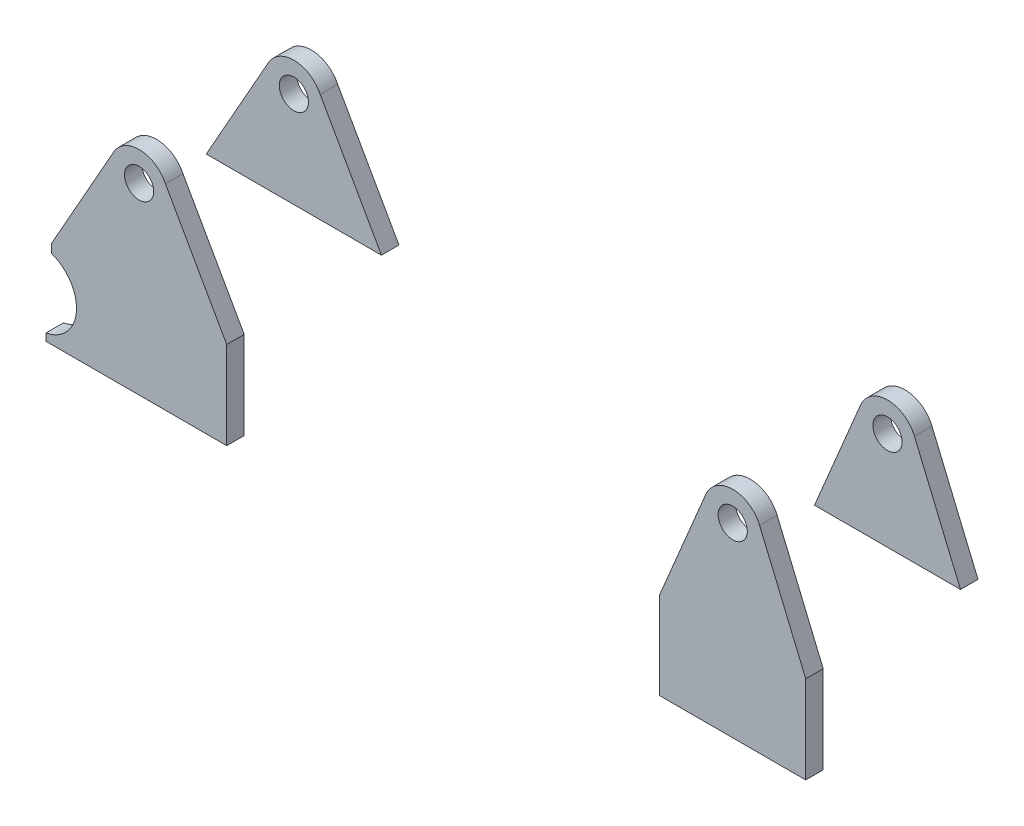
ISO-10303-21;
HEADER;
FILE_DESCRIPTION(('STEP AP214'),'2;1');
FILE_NAME('part.step','',(''),(''),'','','');
FILE_SCHEMA(('AUTOMOTIVE_DESIGN { 1 0 10303 214 1 1 1 1 }'));
ENDSEC;
DATA;
#1=APPLICATION_CONTEXT('core data for automotive mechanical design processes');
#2=APPLICATION_PROTOCOL_DEFINITION('international standard','automotive_design',2000,#1);
#3=PRODUCT_CONTEXT('',#1,'mechanical');
#4=PRODUCT('Part','Part','',(#3));
#5=PRODUCT_RELATED_PRODUCT_CATEGORY('part','',(#4));
#6=PRODUCT_DEFINITION_FORMATION('','',#4);
#7=PRODUCT_DEFINITION_CONTEXT('part definition',#1,'design');
#8=PRODUCT_DEFINITION('design','',#6,#7);
#9=PRODUCT_DEFINITION_SHAPE('','',#8);
#10=(LENGTH_UNIT() NAMED_UNIT(*) SI_UNIT(.MILLI.,.METRE.));
#11=(NAMED_UNIT(*) PLANE_ANGLE_UNIT() SI_UNIT($,.RADIAN.));
#12=(NAMED_UNIT(*) SI_UNIT($,.STERADIAN.) SOLID_ANGLE_UNIT());
#13=UNCERTAINTY_MEASURE_WITH_UNIT(LENGTH_MEASURE(1.E-05),#10,'distance_accuracy_value','');
#14=(GEOMETRIC_REPRESENTATION_CONTEXT(3) GLOBAL_UNCERTAINTY_ASSIGNED_CONTEXT((#13)) GLOBAL_UNIT_ASSIGNED_CONTEXT((#10,
#11,#12)) REPRESENTATION_CONTEXT('',''));
#15=CARTESIAN_POINT('',(0.,0.,0.));
#16=DIRECTION('',(0.,0.,1.));
#17=DIRECTION('',(1.,0.,0.));
#18=AXIS2_PLACEMENT_3D('',#15,#16,#17);
#19=CARTESIAN_POINT('',(-252.417857944728,105.942621529783,-53.));
#20=DIRECTION('',(0.922077125771915,-0.38700616807514,0.));
#21=DIRECTION('',(0.38700616807514,0.922077125771915,0.));
#22=AXIS2_PLACEMENT_3D('',#19,#20,#21);
#23=PLANE('',#22);
#24=DIRECTION('',(0.38700616807514,0.922077125771915,0.));
#25=VECTOR('',#24,1.);
#26=CARTESIAN_POINT('',(-252.417857944728,105.942621529783,-47.));
#27=LINE('',#26,#25);
#28=CARTESIAN_POINT('',(-529.12660318611,-553.340939135816,-47.));
#29=VERTEX_POINT('',#28);
#30=CARTESIAN_POINT('',(-513.347374443829,-515.745502458551,-47.));
#31=VERTEX_POINT('',#30);
#32=EDGE_CURVE('E121',#29,#31,#27,.T.);
#33=ORIENTED_EDGE('',*,*,#32,.T.);
#34=DIRECTION('',(0.,0.,1.));
#35=VECTOR('',#34,1.);
#36=CARTESIAN_POINT('',(-513.347374443829,-515.745502458551,-53.));
#37=LINE('',#36,#35);
#38=CARTESIAN_POINT('',(-513.347374443829,-515.745502458551,-53.));
#39=VERTEX_POINT('',#38);
#40=EDGE_CURVE('E12',#39,#31,#37,.T.);
#41=ORIENTED_EDGE('',*,*,#40,.F.);
#42=DIRECTION('',(0.38700616807514,0.922077125771915,0.));
#43=VECTOR('',#42,1.);
#44=CARTESIAN_POINT('',(-252.417857944728,105.942621529783,-53.));
#45=LINE('',#44,#43);
#46=CARTESIAN_POINT('',(-529.12660318611,-553.340939135816,-53.));
#47=VERTEX_POINT('',#46);
#48=EDGE_CURVE('E104',#47,#39,#45,.T.);
#49=ORIENTED_EDGE('',*,*,#48,.F.);
#50=DIRECTION('',(0.,0.,1.));
#51=VECTOR('',#50,1.);
#52=CARTESIAN_POINT('',(-529.12660318611,-553.340939135816,-53.));
#53=LINE('',#52,#51);
#54=EDGE_CURVE('E71',#47,#29,#53,.T.);
#55=ORIENTED_EDGE('',*,*,#54,.T.);
#56=EDGE_LOOP('',(#33,#41,#49,#55));
#57=FACE_BOUND('',#56,.T.);
#58=ADVANCED_FACE('F54',(#57),#23,.F.);
#59=CARTESIAN_POINT('',(-504.126603186094,-519.615564139322,-53.));
#60=DIRECTION('',(0.,0.,1.));
#61=DIRECTION('',(1.,0.,0.));
#62=AXIS2_PLACEMENT_3D('',#59,#60,#61);
#63=CYLINDRICAL_SURFACE('',#62,10.0000000000078);
#64=CARTESIAN_POINT('',(-504.126603186094,-519.615564139322,-47.));
#65=DIRECTION('',(0.,0.,-1.));
#66=DIRECTION('',(-1.,0.,0.));
#67=AXIS2_PLACEMENT_3D('',#64,#65,#66);
#68=CIRCLE('',#67,10.0000000000078);
#69=CARTESIAN_POINT('',(-494.905831928391,-515.745502458551,-47.));
#70=VERTEX_POINT('',#69);
#71=EDGE_CURVE('E109',#31,#70,#68,.T.);
#72=ORIENTED_EDGE('',*,*,#71,.T.);
#73=DIRECTION('',(0.,0.,1.));
#74=VECTOR('',#73,1.);
#75=CARTESIAN_POINT('',(-494.905831928391,-515.745502458551,-53.));
#76=LINE('',#75,#74);
#77=CARTESIAN_POINT('',(-494.905831928391,-515.745502458551,-53.));
#78=VERTEX_POINT('',#77);
#79=EDGE_CURVE('E63',#78,#70,#76,.T.);
#80=ORIENTED_EDGE('',*,*,#79,.F.);
#81=CARTESIAN_POINT('',(-504.126603186094,-519.615564139322,-53.));
#82=DIRECTION('',(0.,0.,-1.));
#83=DIRECTION('',(-1.,0.,0.));
#84=AXIS2_PLACEMENT_3D('',#81,#82,#83);
#85=CIRCLE('',#84,10.0000000000078);
#86=EDGE_CURVE('E97',#39,#78,#85,.T.);
#87=ORIENTED_EDGE('',*,*,#86,.F.);
#88=ORIENTED_EDGE('',*,*,#40,.T.);
#89=EDGE_LOOP('',(#72,#80,#87,#88));
#90=FACE_BOUND('',#89,.T.);
#91=ADVANCED_FACE('F108',(#90),#63,.T.);
#92=CARTESIAN_POINT('',(-604.825460432263,-253.85206644208,-53.));
#93=DIRECTION('',(-0.922077125771914,-0.387006168075142,0.));
#94=DIRECTION('',(0.387006168075142,-0.922077125771914,0.));
#95=AXIS2_PLACEMENT_3D('',#92,#93,#94);
#96=PLANE('',#95);
#97=DIRECTION('',(0.387006168075142,-0.922077125771914,0.));
#98=VECTOR('',#97,1.);
#99=CARTESIAN_POINT('',(-604.825460432263,-253.85206644208,-47.));
#100=LINE('',#99,#98);
#101=CARTESIAN_POINT('',(-479.12660318611,-553.340939135816,-47.));
#102=VERTEX_POINT('',#101);
#103=EDGE_CURVE('E124',#70,#102,#100,.T.);
#104=ORIENTED_EDGE('',*,*,#103,.T.);
#105=DIRECTION('',(0.,0.,1.));
#106=VECTOR('',#105,1.);
#107=CARTESIAN_POINT('',(-479.12660318611,-553.340939135816,-53.));
#108=LINE('',#107,#106);
#109=CARTESIAN_POINT('',(-479.12660318611,-553.340939135816,-53.));
#110=VERTEX_POINT('',#109);
#111=EDGE_CURVE('E86',#110,#102,#108,.T.);
#112=ORIENTED_EDGE('',*,*,#111,.F.);
#113=DIRECTION('',(0.387006168075142,-0.922077125771914,0.));
#114=VECTOR('',#113,1.);
#115=CARTESIAN_POINT('',(-604.825460432263,-253.85206644208,-53.));
#116=LINE('',#115,#114);
#117=EDGE_CURVE('E103',#78,#110,#116,.T.);
#118=ORIENTED_EDGE('',*,*,#117,.F.);
#119=ORIENTED_EDGE('',*,*,#79,.T.);
#120=EDGE_LOOP('',(#104,#112,#118,#119));
#121=FACE_BOUND('',#120,.T.);
#122=ADVANCED_FACE('F112',(#121),#96,.F.);
#123=CARTESIAN_POINT('',(-504.126603186094,-519.615564139322,-53.));
#124=DIRECTION('',(0.,0.,1.));
#125=DIRECTION('',(1.,0.,0.));
#126=AXIS2_PLACEMENT_3D('',#123,#124,#125);
#127=CYLINDRICAL_SURFACE('',#126,5.00000000003834);
#128=CARTESIAN_POINT('',(-504.126603186094,-519.615564139322,-53.));
#129=DIRECTION('',(0.,0.,-1.));
#130=DIRECTION('',(-1.,0.,0.));
#131=AXIS2_PLACEMENT_3D('',#128,#129,#130);
#132=CIRCLE('',#131,5.00000000003834);
#133=CARTESIAN_POINT('',(-509.126603186132,-519.615564139322,-53.));
#134=VERTEX_POINT('',#133);
#135=EDGE_CURVE('E129',#134,#134,#132,.T.);
#136=ORIENTED_EDGE('',*,*,#135,.T.);
#137=EDGE_LOOP('',(#136));
#138=FACE_BOUND('',#137,.T.);
#139=CARTESIAN_POINT('',(-504.126603186094,-519.615564139322,-47.));
#140=DIRECTION('',(0.,0.,-1.));
#141=DIRECTION('',(-1.,0.,0.));
#142=AXIS2_PLACEMENT_3D('',#139,#140,#141);
#143=CIRCLE('',#142,5.00000000003834);
#144=CARTESIAN_POINT('',(-509.126603186132,-519.615564139322,-47.));
#145=VERTEX_POINT('',#144);
#146=EDGE_CURVE('E118',#145,#145,#143,.T.);
#147=ORIENTED_EDGE('',*,*,#146,.F.);
#148=EDGE_LOOP('',(#147));
#149=FACE_BOUND('',#148,.T.);
#150=ADVANCED_FACE('F56',(#138,#149),#127,.F.);
#151=CARTESIAN_POINT('',(0.,-553.340939135816,-53.));
#152=DIRECTION('',(0.,-1.,0.));
#153=DIRECTION('',(0.,0.,-1.));
#154=AXIS2_PLACEMENT_3D('',#151,#152,#153);
#155=PLANE('',#154);
#156=DIRECTION('',(1.,0.,0.));
#157=VECTOR('',#156,1.);
#158=CARTESIAN_POINT('',(0.,-553.340939135816,-47.));
#159=LINE('',#158,#157);
#160=EDGE_CURVE('E126',#29,#102,#159,.T.);
#161=ORIENTED_EDGE('',*,*,#160,.F.);
#162=ORIENTED_EDGE('',*,*,#54,.F.);
#163=DIRECTION('',(1.,0.,0.));
#164=VECTOR('',#163,1.);
#165=CARTESIAN_POINT('',(0.,-553.340939135816,-53.));
#166=LINE('',#165,#164);
#167=EDGE_CURVE('E113',#47,#110,#166,.T.);
#168=ORIENTED_EDGE('',*,*,#167,.T.);
#169=ORIENTED_EDGE('',*,*,#111,.T.);
#170=EDGE_LOOP('',(#161,#162,#168,#169));
#171=FACE_BOUND('',#170,.T.);
#172=ADVANCED_FACE('F140',(#171),#155,.T.);
#173=CARTESIAN_POINT('',(0.,0.,-53.));
#174=DIRECTION('',(0.,0.,-1.));
#175=DIRECTION('',(-1.,0.,0.));
#176=AXIS2_PLACEMENT_3D('',#173,#174,#175);
#177=PLANE('',#176);
#178=ORIENTED_EDGE('',*,*,#135,.F.);
#179=EDGE_LOOP('',(#178));
#180=FACE_BOUND('',#179,.T.);
#181=ORIENTED_EDGE('',*,*,#48,.T.);
#182=ORIENTED_EDGE('',*,*,#86,.T.);
#183=ORIENTED_EDGE('',*,*,#117,.T.);
#184=ORIENTED_EDGE('',*,*,#167,.F.);
#185=EDGE_LOOP('',(#181,#182,#183,#184));
#186=FACE_BOUND('',#185,.T.);
#187=ADVANCED_FACE('F100',(#180,#186),#177,.T.);
#188=CARTESIAN_POINT('',(0.,0.,-47.));
#189=DIRECTION('',(0.,0.,-1.));
#190=DIRECTION('',(-1.,0.,0.));
#191=AXIS2_PLACEMENT_3D('',#188,#189,#190);
#192=PLANE('',#191);
#193=ORIENTED_EDGE('',*,*,#146,.T.);
#194=EDGE_LOOP('',(#193));
#195=FACE_BOUND('',#194,.T.);
#196=ORIENTED_EDGE('',*,*,#32,.F.);
#197=ORIENTED_EDGE('',*,*,#160,.T.);
#198=ORIENTED_EDGE('',*,*,#103,.F.);
#199=ORIENTED_EDGE('',*,*,#71,.F.);
#200=EDGE_LOOP('',(#196,#197,#198,#199));
#201=FACE_BOUND('',#200,.T.);
#202=ADVANCED_FACE('F139',(#195,#201),#192,.F.);
#203=CLOSED_SHELL('',(#58,#91,#122,#150,#172,#187,#202));
#204=MANIFOLD_SOLID_BREP('B2_NOT_SHOWN',#203);
#205=CARTESIAN_POINT('',(-322.895054586269,182.02048277248,-53.));
#206=DIRECTION('',(0.871123255744899,-0.491064428868969,0.));
#207=DIRECTION('',(0.491064428868969,0.871123255744899,0.));
#208=AXIS2_PLACEMENT_3D('',#205,#206,#207);
#209=PLANE('',#208);
#210=DIRECTION('',(0.491064428868969,0.871123255744899,0.));
#211=VECTOR('',#210,1.);
#212=CARTESIAN_POINT('',(-322.895054586269,182.02048277248,-47.));
#213=LINE('',#212,#211);
#214=CARTESIAN_POINT('',(-737.428628658838,-553.340939135816,-47.));
#215=VERTEX_POINT('',#214);
#216=CARTESIAN_POINT('',(-716.139861216292,-515.575751280396,-47.));
#217=VERTEX_POINT('',#216);
#218=EDGE_CURVE('E304',#215,#217,#213,.T.);
#219=ORIENTED_EDGE('',*,*,#218,.T.);
#220=DIRECTION('',(0.,0.,1.));
#221=VECTOR('',#220,1.);
#222=CARTESIAN_POINT('',(-716.139861216292,-515.575751280396,-53.));
#223=LINE('',#222,#221);
#224=CARTESIAN_POINT('',(-716.139861216292,-515.575751280396,-53.));
#225=VERTEX_POINT('',#224);
#226=EDGE_CURVE('E52',#225,#217,#223,.T.);
#227=ORIENTED_EDGE('',*,*,#226,.F.);
#228=DIRECTION('',(0.491064428868969,0.871123255744899,0.));
#229=VECTOR('',#228,1.);
#230=CARTESIAN_POINT('',(-322.895054586269,182.02048277248,-53.));
#231=LINE('',#230,#229);
#232=CARTESIAN_POINT('',(-737.428628658838,-553.340939135816,-53.));
#233=VERTEX_POINT('',#232);
#234=EDGE_CURVE('E287',#233,#225,#231,.T.);
#235=ORIENTED_EDGE('',*,*,#234,.F.);
#236=DIRECTION('',(0.,0.,1.));
#237=VECTOR('',#236,1.);
#238=CARTESIAN_POINT('',(-737.428628658838,-553.340939135816,-53.));
#239=LINE('',#238,#237);
#240=EDGE_CURVE('E254',#233,#215,#239,.T.);
#241=ORIENTED_EDGE('',*,*,#240,.T.);
#242=EDGE_LOOP('',(#219,#227,#235,#241));
#243=FACE_BOUND('',#242,.T.);
#244=ADVANCED_FACE('F237',(#243),#209,.F.);
#245=CARTESIAN_POINT('',(-707.428628658851,-520.486395569104,-53.));
#246=DIRECTION('',(0.,0.,1.));
#247=DIRECTION('',(1.,0.,0.));
#248=AXIS2_PLACEMENT_3D('',#245,#246,#247);
#249=CYLINDRICAL_SURFACE('',#248,10.0000000000084);
#250=CARTESIAN_POINT('',(-707.428628658851,-520.486395569104,-47.));
#251=DIRECTION('',(0.,0.,-1.));
#252=DIRECTION('',(-1.,0.,0.));
#253=AXIS2_PLACEMENT_3D('',#250,#251,#252);
#254=CIRCLE('',#253,10.0000000000084);
#255=CARTESIAN_POINT('',(-698.394613552515,-516.19843905594,-47.));
#256=VERTEX_POINT('',#255);
#257=EDGE_CURVE('E292',#217,#256,#254,.T.);
#258=ORIENTED_EDGE('',*,*,#257,.T.);
#259=DIRECTION('',(0.,0.,1.));
#260=VECTOR('',#259,1.);
#261=CARTESIAN_POINT('',(-698.394613552515,-516.19843905594,-53.));
#262=LINE('',#261,#260);
#263=CARTESIAN_POINT('',(-698.394613552515,-516.19843905594,-53.));
#264=VERTEX_POINT('',#263);
#265=EDGE_CURVE('E246',#264,#256,#262,.T.);
#266=ORIENTED_EDGE('',*,*,#265,.F.);
#267=CARTESIAN_POINT('',(-707.428628658851,-520.486395569104,-53.));
#268=DIRECTION('',(0.,0.,-1.));
#269=DIRECTION('',(-1.,0.,0.));
#270=AXIS2_PLACEMENT_3D('',#267,#268,#269);
#271=CIRCLE('',#270,10.0000000000084);
#272=EDGE_CURVE('E280',#225,#264,#271,.T.);
#273=ORIENTED_EDGE('',*,*,#272,.F.);
#274=ORIENTED_EDGE('',*,*,#226,.T.);
#275=EDGE_LOOP('',(#258,#266,#273,#274));
#276=FACE_BOUND('',#275,.T.);
#277=ADVANCED_FACE('F291',(#276),#249,.T.);
#278=CARTESIAN_POINT('',(-750.608173049202,-423.698985888743,-53.));
#279=DIRECTION('',(-0.870839920975412,-0.491566711683713,0.));
#280=DIRECTION('',(0.491566711683713,-0.870839920975412,0.));
#281=AXIS2_PLACEMENT_3D('',#278,#279,#280);
#282=PLANE('',#281);
#283=DIRECTION('',(0.491566711683713,-0.870839920975412,0.));
#284=VECTOR('',#283,1.);
#285=CARTESIAN_POINT('',(-750.608173049202,-423.698985888743,-47.));
#286=LINE('',#285,#284);
#287=CARTESIAN_POINT('',(-677.428628658843,-553.340939135816,-47.));
#288=VERTEX_POINT('',#287);
#289=EDGE_CURVE('E307',#256,#288,#286,.T.);
#290=ORIENTED_EDGE('',*,*,#289,.T.);
#291=DIRECTION('',(0.,0.,1.));
#292=VECTOR('',#291,1.);
#293=CARTESIAN_POINT('',(-677.428628658843,-553.340939135816,-53.));
#294=LINE('',#293,#292);
#295=CARTESIAN_POINT('',(-677.428628658843,-553.340939135816,-53.));
#296=VERTEX_POINT('',#295);
#297=EDGE_CURVE('E269',#296,#288,#294,.T.);
#298=ORIENTED_EDGE('',*,*,#297,.F.);
#299=DIRECTION('',(0.491566711683713,-0.870839920975412,0.));
#300=VECTOR('',#299,1.);
#301=CARTESIAN_POINT('',(-750.608173049202,-423.698985888743,-53.));
#302=LINE('',#301,#300);
#303=EDGE_CURVE('E286',#264,#296,#302,.T.);
#304=ORIENTED_EDGE('',*,*,#303,.F.);
#305=ORIENTED_EDGE('',*,*,#265,.T.);
#306=EDGE_LOOP('',(#290,#298,#304,#305));
#307=FACE_BOUND('',#306,.T.);
#308=ADVANCED_FACE('F295',(#307),#282,.F.);
#309=CARTESIAN_POINT('',(-707.428628658851,-520.486395569104,-53.));
#310=DIRECTION('',(0.,0.,1.));
#311=DIRECTION('',(1.,0.,0.));
#312=AXIS2_PLACEMENT_3D('',#309,#310,#311);
#313=CYLINDRICAL_SURFACE('',#312,4.99999999998919);
#314=CARTESIAN_POINT('',(-707.428628658851,-520.486395569104,-53.));
#315=DIRECTION('',(0.,0.,-1.));
#316=DIRECTION('',(-1.,0.,0.));
#317=AXIS2_PLACEMENT_3D('',#314,#315,#316);
#318=CIRCLE('',#317,4.99999999998919);
#319=CARTESIAN_POINT('',(-712.42862865884,-520.486395569104,-53.));
#320=VERTEX_POINT('',#319);
#321=EDGE_CURVE('E312',#320,#320,#318,.T.);
#322=ORIENTED_EDGE('',*,*,#321,.T.);
#323=EDGE_LOOP('',(#322));
#324=FACE_BOUND('',#323,.T.);
#325=CARTESIAN_POINT('',(-707.428628658851,-520.486395569104,-47.));
#326=DIRECTION('',(0.,0.,-1.));
#327=DIRECTION('',(-1.,0.,0.));
#328=AXIS2_PLACEMENT_3D('',#325,#326,#327);
#329=CIRCLE('',#328,4.99999999998919);
#330=CARTESIAN_POINT('',(-712.42862865884,-520.486395569104,-47.));
#331=VERTEX_POINT('',#330);
#332=EDGE_CURVE('E301',#331,#331,#329,.T.);
#333=ORIENTED_EDGE('',*,*,#332,.F.);
#334=EDGE_LOOP('',(#333));
#335=FACE_BOUND('',#334,.T.);
#336=ADVANCED_FACE('F239',(#324,#335),#313,.F.);
#337=CARTESIAN_POINT('',(0.,-553.340939135816,-53.));
#338=DIRECTION('',(0.,-1.,0.));
#339=DIRECTION('',(0.,0.,-1.));
#340=AXIS2_PLACEMENT_3D('',#337,#338,#339);
#341=PLANE('',#340);
#342=DIRECTION('',(1.,0.,0.));
#343=VECTOR('',#342,1.);
#344=CARTESIAN_POINT('',(0.,-553.340939135816,-47.));
#345=LINE('',#344,#343);
#346=EDGE_CURVE('E309',#215,#288,#345,.T.);
#347=ORIENTED_EDGE('',*,*,#346,.F.);
#348=ORIENTED_EDGE('',*,*,#240,.F.);
#349=DIRECTION('',(1.,0.,0.));
#350=VECTOR('',#349,1.);
#351=CARTESIAN_POINT('',(0.,-553.340939135816,-53.));
#352=LINE('',#351,#350);
#353=EDGE_CURVE('E296',#233,#296,#352,.T.);
#354=ORIENTED_EDGE('',*,*,#353,.T.);
#355=ORIENTED_EDGE('',*,*,#297,.T.);
#356=EDGE_LOOP('',(#347,#348,#354,#355));
#357=FACE_BOUND('',#356,.T.);
#358=ADVANCED_FACE('F323',(#357),#341,.T.);
#359=CARTESIAN_POINT('',(0.,0.,-53.));
#360=DIRECTION('',(0.,0.,-1.));
#361=DIRECTION('',(-1.,0.,0.));
#362=AXIS2_PLACEMENT_3D('',#359,#360,#361);
#363=PLANE('',#362);
#364=ORIENTED_EDGE('',*,*,#321,.F.);
#365=EDGE_LOOP('',(#364));
#366=FACE_BOUND('',#365,.T.);
#367=ORIENTED_EDGE('',*,*,#234,.T.);
#368=ORIENTED_EDGE('',*,*,#272,.T.);
#369=ORIENTED_EDGE('',*,*,#303,.T.);
#370=ORIENTED_EDGE('',*,*,#353,.F.);
#371=EDGE_LOOP('',(#367,#368,#369,#370));
#372=FACE_BOUND('',#371,.T.);
#373=ADVANCED_FACE('F283',(#366,#372),#363,.T.);
#374=CARTESIAN_POINT('',(0.,0.,-47.));
#375=DIRECTION('',(0.,0.,-1.));
#376=DIRECTION('',(-1.,0.,0.));
#377=AXIS2_PLACEMENT_3D('',#374,#375,#376);
#378=PLANE('',#377);
#379=ORIENTED_EDGE('',*,*,#332,.T.);
#380=EDGE_LOOP('',(#379));
#381=FACE_BOUND('',#380,.T.);
#382=ORIENTED_EDGE('',*,*,#218,.F.);
#383=ORIENTED_EDGE('',*,*,#346,.T.);
#384=ORIENTED_EDGE('',*,*,#289,.F.);
#385=ORIENTED_EDGE('',*,*,#257,.F.);
#386=EDGE_LOOP('',(#382,#383,#384,#385));
#387=FACE_BOUND('',#386,.T.);
#388=ADVANCED_FACE('F322',(#381,#387),#378,.F.);
#389=CLOSED_SHELL('',(#244,#277,#308,#336,#358,#373,#388));
#390=MANIFOLD_SOLID_BREP('B6_NOT_SHOWN',#389);
#391=CARTESIAN_POINT('',(-741.56019310454,-568.341037304913,6.));
#392=DIRECTION('',(0.,0.,-1.));
#393=DIRECTION('',(-1.,0.,0.));
#394=AXIS2_PLACEMENT_3D('',#391,#392,#393);
#395=CYLINDRICAL_SURFACE('',#394,12.7000000000329);
#396=CARTESIAN_POINT('',(-741.56019310454,-568.341037304913,0.));
#397=DIRECTION('',(0.,0.,1.));
#398=DIRECTION('',(1.,0.,0.));
#399=AXIS2_PLACEMENT_3D('',#396,#397,#398);
#400=CIRCLE('',#399,12.7000000000329);
#401=CARTESIAN_POINT('',(-739.314652140883,-580.840939135816,0.));
#402=VERTEX_POINT('',#401);
#403=CARTESIAN_POINT('',(-737.428628658843,-556.331866841012,0.));
#404=VERTEX_POINT('',#403);
#405=EDGE_CURVE('E517',#402,#404,#400,.T.);
#406=ORIENTED_EDGE('',*,*,#405,.F.);
#407=DIRECTION('',(0.,0.,-1.));
#408=VECTOR('',#407,1.);
#409=CARTESIAN_POINT('',(-739.314652140883,-580.840939135816,6.));
#410=LINE('',#409,#408);
#411=CARTESIAN_POINT('',(-739.314652140883,-580.840939135816,6.));
#412=VERTEX_POINT('',#411);
#413=EDGE_CURVE('E235',#412,#402,#410,.T.);
#414=ORIENTED_EDGE('',*,*,#413,.F.);
#415=CARTESIAN_POINT('',(-741.56019310454,-568.341037304913,6.));
#416=DIRECTION('',(0.,0.,1.));
#417=DIRECTION('',(1.,0.,0.));
#418=AXIS2_PLACEMENT_3D('',#415,#416,#417);
#419=CIRCLE('',#418,12.7000000000329);
#420=CARTESIAN_POINT('',(-737.428628658843,-556.331866841012,6.));
#421=VERTEX_POINT('',#420);
#422=EDGE_CURVE('E539',#412,#421,#419,.T.);
#423=ORIENTED_EDGE('',*,*,#422,.T.);
#424=DIRECTION('',(0.,0.,-1.));
#425=VECTOR('',#424,1.);
#426=CARTESIAN_POINT('',(-737.428628658843,-556.331866841012,6.));
#427=LINE('',#426,#425);
#428=EDGE_CURVE('E469',#421,#404,#427,.T.);
#429=ORIENTED_EDGE('',*,*,#428,.T.);
#430=EDGE_LOOP('',(#406,#414,#423,#429));
#431=FACE_BOUND('',#430,.T.);
#432=ADVANCED_FACE('F419',(#431),#395,.F.);
#433=CARTESIAN_POINT('',(-739.314652140883,0.,6.));
#434=DIRECTION('',(1.,0.,0.));
#435=DIRECTION('',(0.,0.,-1.));
#436=AXIS2_PLACEMENT_3D('',#433,#434,#435);
#437=PLANE('',#436);
#438=DIRECTION('',(0.,-1.,0.));
#439=VECTOR('',#438,1.);
#440=CARTESIAN_POINT('',(-739.314652140883,0.,0.));
#441=LINE('',#440,#439);
#442=CARTESIAN_POINT('',(-739.314652140883,-583.340939135816,0.));
#443=VERTEX_POINT('',#442);
#444=EDGE_CURVE('E520',#402,#443,#441,.T.);
#445=ORIENTED_EDGE('',*,*,#444,.T.);
#446=DIRECTION('',(0.,0.,-1.));
#447=VECTOR('',#446,1.);
#448=CARTESIAN_POINT('',(-739.314652140883,-583.340939135816,6.));
#449=LINE('',#448,#447);
#450=CARTESIAN_POINT('',(-739.314652140883,-583.340939135816,6.));
#451=VERTEX_POINT('',#450);
#452=EDGE_CURVE('E427',#451,#443,#449,.T.);
#453=ORIENTED_EDGE('',*,*,#452,.F.);
#454=DIRECTION('',(0.,-1.,0.));
#455=VECTOR('',#454,1.);
#456=CARTESIAN_POINT('',(-739.314652140883,0.,6.));
#457=LINE('',#456,#455);
#458=EDGE_CURVE('E566',#412,#451,#457,.T.);
#459=ORIENTED_EDGE('',*,*,#458,.F.);
#460=ORIENTED_EDGE('',*,*,#413,.T.);
#461=EDGE_LOOP('',(#445,#453,#459,#460));
#462=FACE_BOUND('',#461,.T.);
#463=ADVANCED_FACE('F570',(#462),#437,.F.);
#464=CARTESIAN_POINT('',(0.,-583.340939135816,6.));
#465=DIRECTION('',(0.,1.,0.));
#466=DIRECTION('',(0.,0.,1.));
#467=AXIS2_PLACEMENT_3D('',#464,#465,#466);
#468=PLANE('',#467);
#469=DIRECTION('',(1.,0.,0.));
#470=VECTOR('',#469,1.);
#471=CARTESIAN_POINT('',(0.,-583.340939135816,0.));
#472=LINE('',#471,#470);
#473=CARTESIAN_POINT('',(-677.428628658843,-583.340939135816,0.));
#474=VERTEX_POINT('',#473);
#475=EDGE_CURVE('E522',#443,#474,#472,.T.);
#476=ORIENTED_EDGE('',*,*,#475,.T.);
#477=DIRECTION('',(0.,0.,-1.));
#478=VECTOR('',#477,1.);
#479=CARTESIAN_POINT('',(-677.428628658843,-583.340939135816,6.));
#480=LINE('',#479,#478);
#481=CARTESIAN_POINT('',(-677.428628658843,-583.340939135816,6.));
#482=VERTEX_POINT('',#481);
#483=EDGE_CURVE('E545',#482,#474,#480,.T.);
#484=ORIENTED_EDGE('',*,*,#483,.F.);
#485=DIRECTION('',(1.,0.,0.));
#486=VECTOR('',#485,1.);
#487=CARTESIAN_POINT('',(0.,-583.340939135816,6.));
#488=LINE('',#487,#486);
#489=EDGE_CURVE('E553',#451,#482,#488,.T.);
#490=ORIENTED_EDGE('',*,*,#489,.F.);
#491=ORIENTED_EDGE('',*,*,#452,.T.);
#492=EDGE_LOOP('',(#476,#484,#490,#491));
#493=FACE_BOUND('',#492,.T.);
#494=ADVANCED_FACE('F551',(#493),#468,.F.);
#495=CARTESIAN_POINT('',(-677.428628658843,0.,6.));
#496=DIRECTION('',(1.,0.,0.));
#497=DIRECTION('',(0.,0.,-1.));
#498=AXIS2_PLACEMENT_3D('',#495,#496,#497);
#499=PLANE('',#498);
#500=DIRECTION('',(0.,-1.,0.));
#501=VECTOR('',#500,1.);
#502=CARTESIAN_POINT('',(-677.428628658843,0.,0.));
#503=LINE('',#502,#501);
#504=CARTESIAN_POINT('',(-677.428628658843,-553.340939135816,0.));
#505=VERTEX_POINT('',#504);
#506=EDGE_CURVE('E525',#505,#474,#503,.T.);
#507=ORIENTED_EDGE('',*,*,#506,.F.);
#508=DIRECTION('',(0.,0.,-1.));
#509=VECTOR('',#508,1.);
#510=CARTESIAN_POINT('',(-677.428628658843,-553.340939135816,6.));
#511=LINE('',#510,#509);
#512=CARTESIAN_POINT('',(-677.428628658843,-553.340939135816,6.));
#513=VERTEX_POINT('',#512);
#514=EDGE_CURVE('E543',#513,#505,#511,.T.);
#515=ORIENTED_EDGE('',*,*,#514,.F.);
#516=DIRECTION('',(0.,-1.,0.));
#517=VECTOR('',#516,1.);
#518=CARTESIAN_POINT('',(-677.428628658843,0.,6.));
#519=LINE('',#518,#517);
#520=EDGE_CURVE('E564',#513,#482,#519,.T.);
#521=ORIENTED_EDGE('',*,*,#520,.T.);
#522=ORIENTED_EDGE('',*,*,#483,.T.);
#523=EDGE_LOOP('',(#507,#515,#521,#522));
#524=FACE_BOUND('',#523,.T.);
#525=ADVANCED_FACE('F562',(#524),#499,.T.);
#526=CARTESIAN_POINT('',(-750.608173049202,-423.698985888743,6.));
#527=DIRECTION('',(0.870839920975412,0.491566711683713,0.));
#528=DIRECTION('',(-0.491566711683713,0.870839920975412,0.));
#529=AXIS2_PLACEMENT_3D('',#526,#527,#528);
#530=PLANE('',#529);
#531=DIRECTION('',(0.491566711683713,-0.870839920975412,0.));
#532=VECTOR('',#531,1.);
#533=CARTESIAN_POINT('',(-750.608173049202,-423.698985888743,0.));
#534=LINE('',#533,#532);
#535=CARTESIAN_POINT('',(-698.394613552515,-516.19843905594,0.));
#536=VERTEX_POINT('',#535);
#537=EDGE_CURVE('E528',#536,#505,#534,.T.);
#538=ORIENTED_EDGE('',*,*,#537,.F.);
#539=DIRECTION('',(0.,0.,-1.));
#540=VECTOR('',#539,1.);
#541=CARTESIAN_POINT('',(-698.394613552515,-516.19843905594,6.));
#542=LINE('',#541,#540);
#543=CARTESIAN_POINT('',(-698.394613552515,-516.19843905594,6.));
#544=VERTEX_POINT('',#543);
#545=EDGE_CURVE('E507',#544,#536,#542,.T.);
#546=ORIENTED_EDGE('',*,*,#545,.F.);
#547=DIRECTION('',(0.491566711683713,-0.870839920975412,0.));
#548=VECTOR('',#547,1.);
#549=CARTESIAN_POINT('',(-750.608173049202,-423.698985888743,6.));
#550=LINE('',#549,#548);
#551=EDGE_CURVE('E496',#544,#513,#550,.T.);
#552=ORIENTED_EDGE('',*,*,#551,.T.);
#553=ORIENTED_EDGE('',*,*,#514,.T.);
#554=EDGE_LOOP('',(#538,#546,#552,#553));
#555=FACE_BOUND('',#554,.T.);
#556=ADVANCED_FACE('F580',(#555),#530,.T.);
#557=CARTESIAN_POINT('',(-707.428628658843,-520.486395569086,6.));
#558=DIRECTION('',(0.,0.,-1.));
#559=DIRECTION('',(-1.,0.,0.));
#560=AXIS2_PLACEMENT_3D('',#557,#558,#559);
#561=CYLINDRICAL_SURFACE('',#560,9.99999999999998);
#562=CARTESIAN_POINT('',(-707.428628658843,-520.486395569086,0.));
#563=DIRECTION('',(0.,0.,1.));
#564=DIRECTION('',(1.,0.,0.));
#565=AXIS2_PLACEMENT_3D('',#562,#563,#564);
#566=CIRCLE('',#565,9.99999999999998);
#567=CARTESIAN_POINT('',(-716.139861216292,-515.575751280396,0.));
#568=VERTEX_POINT('',#567);
#569=EDGE_CURVE('E503',#536,#568,#566,.T.);
#570=ORIENTED_EDGE('',*,*,#569,.T.);
#571=DIRECTION('',(0.,0.,-1.));
#572=VECTOR('',#571,1.);
#573=CARTESIAN_POINT('',(-716.139861216292,-515.575751280396,6.));
#574=LINE('',#573,#572);
#575=CARTESIAN_POINT('',(-716.139861216292,-515.575751280396,6.));
#576=VERTEX_POINT('',#575);
#577=EDGE_CURVE('E500',#576,#568,#574,.T.);
#578=ORIENTED_EDGE('',*,*,#577,.F.);
#579=CARTESIAN_POINT('',(-707.428628658843,-520.486395569086,6.));
#580=DIRECTION('',(0.,0.,1.));
#581=DIRECTION('',(1.,0.,0.));
#582=AXIS2_PLACEMENT_3D('',#579,#580,#581);
#583=CIRCLE('',#582,9.99999999999998);
#584=EDGE_CURVE('E488',#544,#576,#583,.T.);
#585=ORIENTED_EDGE('',*,*,#584,.F.);
#586=ORIENTED_EDGE('',*,*,#545,.T.);
#587=EDGE_LOOP('',(#570,#578,#585,#586));
#588=FACE_BOUND('',#587,.T.);
#589=ADVANCED_FACE('F501',(#588),#561,.T.);
#590=CARTESIAN_POINT('',(-322.895054586268,182.020482772479,6.));
#591=DIRECTION('',(-0.871123255744899,0.49106442886897,0.));
#592=DIRECTION('',(-0.49106442886897,-0.871123255744899,0.));
#593=AXIS2_PLACEMENT_3D('',#590,#591,#592);
#594=PLANE('',#593);
#595=DIRECTION('',(0.49106442886897,0.871123255744899,0.));
#596=VECTOR('',#595,1.);
#597=CARTESIAN_POINT('',(-322.895054586268,182.020482772479,0.));
#598=LINE('',#597,#596);
#599=CARTESIAN_POINT('',(-737.428628658843,-553.340939135816,0.));
#600=VERTEX_POINT('',#599);
#601=EDGE_CURVE('E532',#600,#568,#598,.T.);
#602=ORIENTED_EDGE('',*,*,#601,.F.);
#603=DIRECTION('',(0.,0.,-1.));
#604=VECTOR('',#603,1.);
#605=CARTESIAN_POINT('',(-737.428628658843,-553.340939135816,6.));
#606=LINE('',#605,#604);
#607=CARTESIAN_POINT('',(-737.428628658843,-553.340939135816,6.));
#608=VERTEX_POINT('',#607);
#609=EDGE_CURVE('E462',#608,#600,#606,.T.);
#610=ORIENTED_EDGE('',*,*,#609,.F.);
#611=DIRECTION('',(0.49106442886897,0.871123255744899,0.));
#612=VECTOR('',#611,1.);
#613=CARTESIAN_POINT('',(-322.895054586268,182.020482772479,6.));
#614=LINE('',#613,#612);
#615=EDGE_CURVE('E493',#608,#576,#614,.T.);
#616=ORIENTED_EDGE('',*,*,#615,.T.);
#617=ORIENTED_EDGE('',*,*,#577,.T.);
#618=EDGE_LOOP('',(#602,#610,#616,#617));
#619=FACE_BOUND('',#618,.T.);
#620=ADVANCED_FACE('F509',(#619),#594,.T.);
#621=CARTESIAN_POINT('',(-737.428628658822,2.73731204245609E-11,6.));
#622=DIRECTION('',(1.,0.,0.));
#623=DIRECTION('',(0.,1.,0.));
#624=AXIS2_PLACEMENT_3D('',#621,#622,#623);
#625=PLANE('',#624);
#626=DIRECTION('',(0.,-1.,0.));
#627=VECTOR('',#626,1.);
#628=CARTESIAN_POINT('',(-737.428628658822,2.73731204245609E-11,0.));
#629=LINE('',#628,#627);
#630=EDGE_CURVE('E534',#600,#404,#629,.T.);
#631=ORIENTED_EDGE('',*,*,#630,.T.);
#632=ORIENTED_EDGE('',*,*,#428,.F.);
#633=DIRECTION('',(0.,-1.,0.));
#634=VECTOR('',#633,1.);
#635=CARTESIAN_POINT('',(-737.428628658822,2.73731204245609E-11,6.));
#636=LINE('',#635,#634);
#637=EDGE_CURVE('E435',#608,#421,#636,.T.);
#638=ORIENTED_EDGE('',*,*,#637,.F.);
#639=ORIENTED_EDGE('',*,*,#609,.T.);
#640=EDGE_LOOP('',(#631,#632,#638,#639));
#641=FACE_BOUND('',#640,.T.);
#642=ADVANCED_FACE('F588',(#641),#625,.F.);
#643=CARTESIAN_POINT('',(-707.428628658851,-520.486395569104,6.));
#644=DIRECTION('',(0.,0.,-1.));
#645=DIRECTION('',(-1.,0.,0.));
#646=AXIS2_PLACEMENT_3D('',#643,#644,#645);
#647=CYLINDRICAL_SURFACE('',#646,4.99999999999997);
#648=CARTESIAN_POINT('',(-707.428628658851,-520.486395569104,6.));
#649=DIRECTION('',(0.,0.,1.));
#650=DIRECTION('',(1.,0.,0.));
#651=AXIS2_PLACEMENT_3D('',#648,#649,#650);
#652=CIRCLE('',#651,4.99999999999997);
#653=CARTESIAN_POINT('',(-702.428628658851,-520.486395569104,6.));
#654=VERTEX_POINT('',#653);
#655=EDGE_CURVE('E511',#654,#654,#652,.T.);
#656=ORIENTED_EDGE('',*,*,#655,.T.);
#657=EDGE_LOOP('',(#656));
#658=FACE_BOUND('',#657,.T.);
#659=CARTESIAN_POINT('',(-707.428628658851,-520.486395569104,0.));
#660=DIRECTION('',(0.,0.,1.));
#661=DIRECTION('',(1.,0.,0.));
#662=AXIS2_PLACEMENT_3D('',#659,#660,#661);
#663=CIRCLE('',#662,4.99999999999997);
#664=CARTESIAN_POINT('',(-702.428628658851,-520.486395569104,0.));
#665=VERTEX_POINT('',#664);
#666=EDGE_CURVE('E536',#665,#665,#663,.T.);
#667=ORIENTED_EDGE('',*,*,#666,.F.);
#668=EDGE_LOOP('',(#667));
#669=FACE_BOUND('',#668,.T.);
#670=ADVANCED_FACE('F591',(#658,#669),#647,.F.);
#671=CARTESIAN_POINT('',(0.,0.,6.));
#672=DIRECTION('',(0.,0.,1.));
#673=DIRECTION('',(1.,0.,0.));
#674=AXIS2_PLACEMENT_3D('',#671,#672,#673);
#675=PLANE('',#674);
#676=ORIENTED_EDGE('',*,*,#422,.F.);
#677=ORIENTED_EDGE('',*,*,#458,.T.);
#678=ORIENTED_EDGE('',*,*,#489,.T.);
#679=ORIENTED_EDGE('',*,*,#520,.F.);
#680=ORIENTED_EDGE('',*,*,#551,.F.);
#681=ORIENTED_EDGE('',*,*,#584,.T.);
#682=ORIENTED_EDGE('',*,*,#615,.F.);
#683=ORIENTED_EDGE('',*,*,#637,.T.);
#684=EDGE_LOOP('',(#676,#677,#678,#679,#680,#681,#682,#683));
#685=FACE_BOUND('',#684,.T.);
#686=ORIENTED_EDGE('',*,*,#655,.F.);
#687=EDGE_LOOP('',(#686));
#688=FACE_BOUND('',#687,.T.);
#689=ADVANCED_FACE('F490',(#685,#688),#675,.T.);
#690=CARTESIAN_POINT('',(0.,0.,0.));
#691=DIRECTION('',(0.,0.,1.));
#692=DIRECTION('',(1.,0.,0.));
#693=AXIS2_PLACEMENT_3D('',#690,#691,#692);
#694=PLANE('',#693);
#695=ORIENTED_EDGE('',*,*,#405,.T.);
#696=ORIENTED_EDGE('',*,*,#630,.F.);
#697=ORIENTED_EDGE('',*,*,#601,.T.);
#698=ORIENTED_EDGE('',*,*,#569,.F.);
#699=ORIENTED_EDGE('',*,*,#537,.T.);
#700=ORIENTED_EDGE('',*,*,#506,.T.);
#701=ORIENTED_EDGE('',*,*,#475,.F.);
#702=ORIENTED_EDGE('',*,*,#444,.F.);
#703=EDGE_LOOP('',(#695,#696,#697,#698,#699,#700,#701,#702));
#704=FACE_BOUND('',#703,.T.);
#705=ORIENTED_EDGE('',*,*,#666,.T.);
#706=EDGE_LOOP('',(#705));
#707=FACE_BOUND('',#706,.T.);
#708=ADVANCED_FACE('F557',(#704,#707),#694,.F.);
#709=CLOSED_SHELL('',(#432,#463,#494,#525,#556,#589,#620,#642,#670,#689,#708));
#710=MANIFOLD_SOLID_BREP('B46',#709);
#711=CARTESIAN_POINT('',(0.,-583.340939135816,6.));
#712=DIRECTION('',(0.,1.,0.));
#713=DIRECTION('',(0.,0.,1.));
#714=AXIS2_PLACEMENT_3D('',#711,#712,#713);
#715=PLANE('',#714);
#716=DIRECTION('',(1.,0.,0.));
#717=VECTOR('',#716,1.);
#718=CARTESIAN_POINT('',(0.,-583.340939135816,0.));
#719=LINE('',#718,#717);
#720=CARTESIAN_POINT('',(-529.12660318611,-583.340939135816,0.));
#721=VERTEX_POINT('',#720);
#722=CARTESIAN_POINT('',(-479.12660318611,-583.340939135816,0.));
#723=VERTEX_POINT('',#722);
#724=EDGE_CURVE('E814',#721,#723,#719,.T.);
#725=ORIENTED_EDGE('',*,*,#724,.T.);
#726=DIRECTION('',(0.,0.,-1.));
#727=VECTOR('',#726,1.);
#728=CARTESIAN_POINT('',(-479.12660318611,-583.340939135816,6.));
#729=LINE('',#728,#727);
#730=CARTESIAN_POINT('',(-479.12660318611,-583.340939135816,6.));
#731=VERTEX_POINT('',#730);
#732=EDGE_CURVE('E417',#731,#723,#729,.T.);
#733=ORIENTED_EDGE('',*,*,#732,.F.);
#734=DIRECTION('',(1.,0.,0.));
#735=VECTOR('',#734,1.);
#736=CARTESIAN_POINT('',(0.,-583.340939135816,6.));
#737=LINE('',#736,#735);
#738=CARTESIAN_POINT('',(-529.12660318611,-583.340939135816,6.));
#739=VERTEX_POINT('',#738);
#740=EDGE_CURVE('E829',#739,#731,#737,.T.);
#741=ORIENTED_EDGE('',*,*,#740,.F.);
#742=DIRECTION('',(0.,0.,-1.));
#743=VECTOR('',#742,1.);
#744=CARTESIAN_POINT('',(-529.12660318611,-583.340939135816,6.));
#745=LINE('',#744,#743);
#746=EDGE_CURVE('E813',#739,#721,#745,.T.);
#747=ORIENTED_EDGE('',*,*,#746,.T.);
#748=EDGE_LOOP('',(#725,#733,#741,#747));
#749=FACE_BOUND('',#748,.T.);
#750=ADVANCED_FACE('F727',(#749),#715,.F.);
#751=CARTESIAN_POINT('',(-479.12660318611,0.,6.));
#752=DIRECTION('',(-1.,0.,0.));
#753=DIRECTION('',(0.,0.,1.));
#754=AXIS2_PLACEMENT_3D('',#751,#752,#753);
#755=PLANE('',#754);
#756=DIRECTION('',(0.,1.,0.));
#757=VECTOR('',#756,1.);
#758=CARTESIAN_POINT('',(-479.12660318611,0.,0.));
#759=LINE('',#758,#757);
#760=CARTESIAN_POINT('',(-479.12660318611,-553.340939135816,0.));
#761=VERTEX_POINT('',#760);
#762=EDGE_CURVE('E817',#723,#761,#759,.T.);
#763=ORIENTED_EDGE('',*,*,#762,.T.);
#764=DIRECTION('',(0.,0.,-1.));
#765=VECTOR('',#764,1.);
#766=CARTESIAN_POINT('',(-479.12660318611,-553.340939135816,6.));
#767=LINE('',#766,#765);
#768=CARTESIAN_POINT('',(-479.12660318611,-553.340939135816,6.));
#769=VERTEX_POINT('',#768);
#770=EDGE_CURVE('E735',#769,#761,#767,.T.);
#771=ORIENTED_EDGE('',*,*,#770,.F.);
#772=DIRECTION('',(0.,1.,0.));
#773=VECTOR('',#772,1.);
#774=CARTESIAN_POINT('',(-479.12660318611,0.,6.));
#775=LINE('',#774,#773);
#776=EDGE_CURVE('E780',#731,#769,#775,.T.);
#777=ORIENTED_EDGE('',*,*,#776,.F.);
#778=ORIENTED_EDGE('',*,*,#732,.T.);
#779=EDGE_LOOP('',(#763,#771,#777,#778));
#780=FACE_BOUND('',#779,.T.);
#781=ADVANCED_FACE('F835',(#780),#755,.F.);
#782=CARTESIAN_POINT('',(-604.825460432263,-253.852066442077,6.));
#783=DIRECTION('',(0.922077125771916,0.387006168075139,0.));
#784=DIRECTION('',(-0.387006168075139,0.922077125771916,0.));
#785=AXIS2_PLACEMENT_3D('',#782,#783,#784);
#786=PLANE('',#785);
#787=DIRECTION('',(0.387006168075139,-0.922077125771916,0.));
#788=VECTOR('',#787,1.);
#789=CARTESIAN_POINT('',(-604.825460432263,-253.852066442077,0.));
#790=LINE('',#789,#788);
#791=CARTESIAN_POINT('',(-494.905831928391,-515.745502458551,0.));
#792=VERTEX_POINT('',#791);
#793=EDGE_CURVE('E820',#792,#761,#790,.T.);
#794=ORIENTED_EDGE('',*,*,#793,.F.);
#795=DIRECTION('',(0.,0.,-1.));
#796=VECTOR('',#795,1.);
#797=CARTESIAN_POINT('',(-494.905831928391,-515.745502458551,6.));
#798=LINE('',#797,#796);
#799=CARTESIAN_POINT('',(-494.905831928391,-515.745502458551,6.));
#800=VERTEX_POINT('',#799);
#801=EDGE_CURVE('E802',#800,#792,#798,.T.);
#802=ORIENTED_EDGE('',*,*,#801,.F.);
#803=DIRECTION('',(0.387006168075139,-0.922077125771916,0.));
#804=VECTOR('',#803,1.);
#805=CARTESIAN_POINT('',(-604.825460432263,-253.852066442077,6.));
#806=LINE('',#805,#804);
#807=EDGE_CURVE('E795',#800,#769,#806,.T.);
#808=ORIENTED_EDGE('',*,*,#807,.T.);
#809=ORIENTED_EDGE('',*,*,#770,.T.);
#810=EDGE_LOOP('',(#794,#802,#808,#809));
#811=FACE_BOUND('',#810,.T.);
#812=ADVANCED_FACE('F834',(#811),#786,.T.);
#813=CARTESIAN_POINT('',(-504.12660318611,-519.615564139302,6.));
#814=DIRECTION('',(0.,0.,-1.));
#815=DIRECTION('',(-1.,0.,0.));
#816=AXIS2_PLACEMENT_3D('',#813,#814,#815);
#817=CYLINDRICAL_SURFACE('',#816,9.99999999999998);
#818=CARTESIAN_POINT('',(-504.12660318611,-519.615564139302,0.));
#819=DIRECTION('',(0.,0.,1.));
#820=DIRECTION('',(1.,0.,0.));
#821=AXIS2_PLACEMENT_3D('',#818,#819,#820);
#822=CIRCLE('',#821,9.99999999999998);
#823=CARTESIAN_POINT('',(-513.347374443829,-515.745502458551,0.));
#824=VERTEX_POINT('',#823);
#825=EDGE_CURVE('E801',#792,#824,#822,.T.);
#826=ORIENTED_EDGE('',*,*,#825,.T.);
#827=DIRECTION('',(0.,0.,-1.));
#828=VECTOR('',#827,1.);
#829=CARTESIAN_POINT('',(-513.347374443829,-515.745502458551,6.));
#830=LINE('',#829,#828);
#831=CARTESIAN_POINT('',(-513.347374443829,-515.745502458551,6.));
#832=VERTEX_POINT('',#831);
#833=EDGE_CURVE('E798',#832,#824,#830,.T.);
#834=ORIENTED_EDGE('',*,*,#833,.F.);
#835=CARTESIAN_POINT('',(-504.12660318611,-519.615564139302,6.));
#836=DIRECTION('',(0.,0.,1.));
#837=DIRECTION('',(1.,0.,0.));
#838=AXIS2_PLACEMENT_3D('',#835,#836,#837);
#839=CIRCLE('',#838,9.99999999999998);
#840=EDGE_CURVE('E788',#800,#832,#839,.T.);
#841=ORIENTED_EDGE('',*,*,#840,.F.);
#842=ORIENTED_EDGE('',*,*,#801,.T.);
#843=EDGE_LOOP('',(#826,#834,#841,#842));
#844=FACE_BOUND('',#843,.T.);
#845=ADVANCED_FACE('F799',(#844),#817,.T.);
#846=CARTESIAN_POINT('',(-252.417857944728,105.942621529783,6.));
#847=DIRECTION('',(0.922077125771915,-0.38700616807514,0.));
#848=DIRECTION('',(0.38700616807514,0.922077125771915,0.));
#849=AXIS2_PLACEMENT_3D('',#846,#847,#848);
#850=PLANE('',#849);
#851=DIRECTION('',(-0.38700616807514,-0.922077125771915,0.));
#852=VECTOR('',#851,1.);
#853=CARTESIAN_POINT('',(-252.417857944728,105.942621529783,0.));
#854=LINE('',#853,#852);
#855=CARTESIAN_POINT('',(-529.126603186111,-553.340939135816,0.));
#856=VERTEX_POINT('',#855);
#857=EDGE_CURVE('E766',#824,#856,#854,.T.);
#858=ORIENTED_EDGE('',*,*,#857,.T.);
#859=DIRECTION('',(0.,0.,-1.));
#860=VECTOR('',#859,1.);
#861=CARTESIAN_POINT('',(-529.126603186111,-553.340939135816,6.));
#862=LINE('',#861,#860);
#863=CARTESIAN_POINT('',(-529.126603186111,-553.340939135816,6.));
#864=VERTEX_POINT('',#863);
#865=EDGE_CURVE('E803',#864,#856,#862,.T.);
#866=ORIENTED_EDGE('',*,*,#865,.F.);
#867=DIRECTION('',(-0.38700616807514,-0.922077125771915,0.));
#868=VECTOR('',#867,1.);
#869=CARTESIAN_POINT('',(-252.417857944728,105.942621529783,6.));
#870=LINE('',#869,#868);
#871=EDGE_CURVE('E793',#832,#864,#870,.T.);
#872=ORIENTED_EDGE('',*,*,#871,.F.);
#873=ORIENTED_EDGE('',*,*,#833,.T.);
#874=EDGE_LOOP('',(#858,#866,#872,#873));
#875=FACE_BOUND('',#874,.T.);
#876=ADVANCED_FACE('F805',(#875),#850,.F.);
#877=CARTESIAN_POINT('',(-529.126603186112,-1.95816179266307E-12,6.));
#878=DIRECTION('',(1.,0.,0.));
#879=DIRECTION('',(0.,1.,0.));
#880=AXIS2_PLACEMENT_3D('',#877,#878,#879);
#881=PLANE('',#880);
#882=DIRECTION('',(0.,-1.,0.));
#883=VECTOR('',#882,1.);
#884=CARTESIAN_POINT('',(-529.126603186112,-1.95816179266307E-12,0.));
#885=LINE('',#884,#883);
#886=EDGE_CURVE('E772',#856,#721,#885,.T.);
#887=ORIENTED_EDGE('',*,*,#886,.T.);
#888=ORIENTED_EDGE('',*,*,#746,.F.);
#889=DIRECTION('',(0.,-1.,0.));
#890=VECTOR('',#889,1.);
#891=CARTESIAN_POINT('',(-529.126603186112,-1.95816179266307E-12,6.));
#892=LINE('',#891,#890);
#893=EDGE_CURVE('E743',#864,#739,#892,.T.);
#894=ORIENTED_EDGE('',*,*,#893,.F.);
#895=ORIENTED_EDGE('',*,*,#865,.T.);
#896=EDGE_LOOP('',(#887,#888,#894,#895));
#897=FACE_BOUND('',#896,.T.);
#898=ADVANCED_FACE('F843',(#897),#881,.F.);
#899=CARTESIAN_POINT('',(-504.126603186094,-519.615564139322,6.));
#900=DIRECTION('',(0.,0.,-1.));
#901=DIRECTION('',(-1.,0.,0.));
#902=AXIS2_PLACEMENT_3D('',#899,#900,#901);
#903=CYLINDRICAL_SURFACE('',#902,5.00000000000003);
#904=CARTESIAN_POINT('',(-504.126603186094,-519.615564139322,6.));
#905=DIRECTION('',(0.,0.,1.));
#906=DIRECTION('',(1.,0.,0.));
#907=AXIS2_PLACEMENT_3D('',#904,#905,#906);
#908=CIRCLE('',#907,5.00000000000003);
#909=CARTESIAN_POINT('',(-499.126603186094,-519.615564139322,6.));
#910=VERTEX_POINT('',#909);
#911=EDGE_CURVE('E807',#910,#910,#908,.T.);
#912=ORIENTED_EDGE('',*,*,#911,.T.);
#913=EDGE_LOOP('',(#912));
#914=FACE_BOUND('',#913,.T.);
#915=CARTESIAN_POINT('',(-504.126603186094,-519.615564139322,0.));
#916=DIRECTION('',(0.,0.,1.));
#917=DIRECTION('',(1.,0.,0.));
#918=AXIS2_PLACEMENT_3D('',#915,#916,#917);
#919=CIRCLE('',#918,5.00000000000003);
#920=CARTESIAN_POINT('',(-499.126603186094,-519.615564139322,0.));
#921=VERTEX_POINT('',#920);
#922=EDGE_CURVE('E826',#921,#921,#919,.T.);
#923=ORIENTED_EDGE('',*,*,#922,.F.);
#924=EDGE_LOOP('',(#923));
#925=FACE_BOUND('',#924,.T.);
#926=ADVANCED_FACE('F845',(#914,#925),#903,.F.);
#927=CARTESIAN_POINT('',(0.,0.,6.));
#928=DIRECTION('',(0.,0.,1.));
#929=DIRECTION('',(1.,0.,0.));
#930=AXIS2_PLACEMENT_3D('',#927,#928,#929);
#931=PLANE('',#930);
#932=ORIENTED_EDGE('',*,*,#740,.T.);
#933=ORIENTED_EDGE('',*,*,#776,.T.);
#934=ORIENTED_EDGE('',*,*,#807,.F.);
#935=ORIENTED_EDGE('',*,*,#840,.T.);
#936=ORIENTED_EDGE('',*,*,#871,.T.);
#937=ORIENTED_EDGE('',*,*,#893,.T.);
#938=EDGE_LOOP('',(#932,#933,#934,#935,#936,#937));
#939=FACE_BOUND('',#938,.T.);
#940=ORIENTED_EDGE('',*,*,#911,.F.);
#941=EDGE_LOOP('',(#940));
#942=FACE_BOUND('',#941,.T.);
#943=ADVANCED_FACE('F790',(#939,#942),#931,.T.);
#944=CARTESIAN_POINT('',(0.,0.,0.));
#945=DIRECTION('',(0.,0.,1.));
#946=DIRECTION('',(1.,0.,0.));
#947=AXIS2_PLACEMENT_3D('',#944,#945,#946);
#948=PLANE('',#947);
#949=ORIENTED_EDGE('',*,*,#724,.F.);
#950=ORIENTED_EDGE('',*,*,#886,.F.);
#951=ORIENTED_EDGE('',*,*,#857,.F.);
#952=ORIENTED_EDGE('',*,*,#825,.F.);
#953=ORIENTED_EDGE('',*,*,#793,.T.);
#954=ORIENTED_EDGE('',*,*,#762,.F.);
#955=EDGE_LOOP('',(#949,#950,#951,#952,#953,#954));
#956=FACE_BOUND('',#955,.T.);
#957=ORIENTED_EDGE('',*,*,#922,.T.);
#958=EDGE_LOOP('',(#957));
#959=FACE_BOUND('',#958,.T.);
#960=ADVANCED_FACE('F839',(#956,#959),#948,.F.);
#961=CLOSED_SHELL('',(#750,#781,#812,#845,#876,#898,#926,#943,#960));
#962=MANIFOLD_SOLID_BREP('B229',#961);
#963=ADVANCED_BREP_SHAPE_REPRESENTATION('',(#18,#204,#390,#710,#962),#14);
#964=SHAPE_DEFINITION_REPRESENTATION(#9,#963);
ENDSEC;
END-ISO-10303-21;
